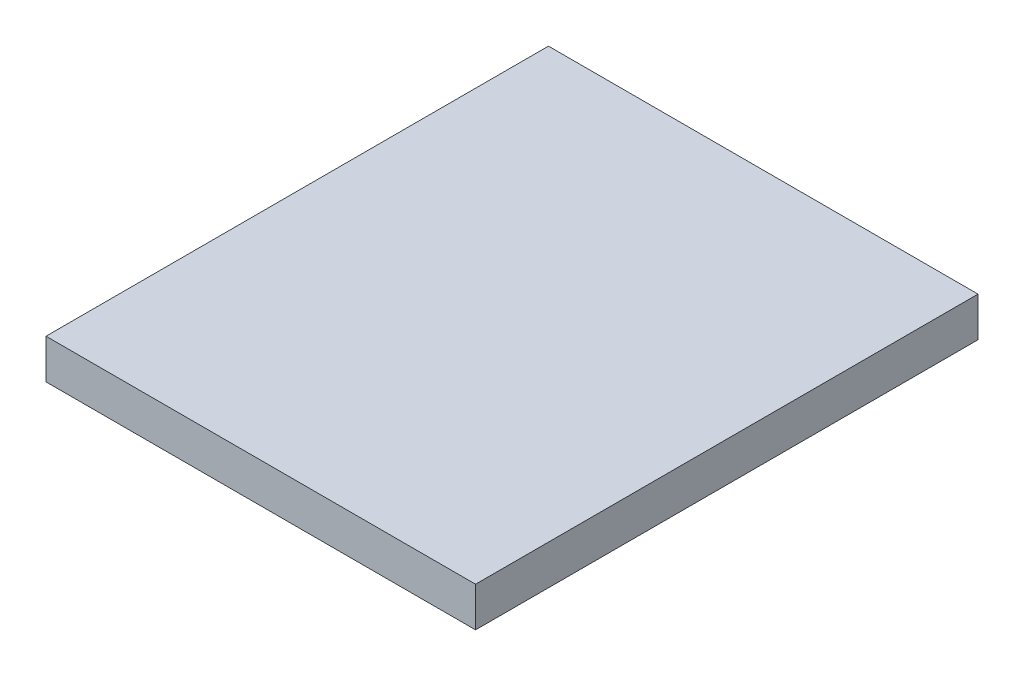
ISO-10303-21;
HEADER;
FILE_DESCRIPTION(('STEP AP214'),'2;1');
FILE_NAME('part.step','',(''),(''),'','','');
FILE_SCHEMA(('AUTOMOTIVE_DESIGN { 1 0 10303 214 1 1 1 1 }'));
ENDSEC;
DATA;
#1=APPLICATION_CONTEXT('core data for automotive mechanical design processes');
#2=APPLICATION_PROTOCOL_DEFINITION('international standard','automotive_design',2000,#1);
#3=PRODUCT_CONTEXT('',#1,'mechanical');
#4=PRODUCT('Part','Part','',(#3));
#5=PRODUCT_RELATED_PRODUCT_CATEGORY('part','',(#4));
#6=PRODUCT_DEFINITION_FORMATION('','',#4);
#7=PRODUCT_DEFINITION_CONTEXT('part definition',#1,'design');
#8=PRODUCT_DEFINITION('design','',#6,#7);
#9=PRODUCT_DEFINITION_SHAPE('','',#8);
#10=(LENGTH_UNIT() NAMED_UNIT(*) SI_UNIT(.MILLI.,.METRE.));
#11=(NAMED_UNIT(*) PLANE_ANGLE_UNIT() SI_UNIT($,.RADIAN.));
#12=(NAMED_UNIT(*) SI_UNIT($,.STERADIAN.) SOLID_ANGLE_UNIT());
#13=UNCERTAINTY_MEASURE_WITH_UNIT(LENGTH_MEASURE(1.E-05),#10,'distance_accuracy_value','');
#14=(GEOMETRIC_REPRESENTATION_CONTEXT(3) GLOBAL_UNCERTAINTY_ASSIGNED_CONTEXT((#13)) GLOBAL_UNIT_ASSIGNED_CONTEXT((#10,
#11,#12)) REPRESENTATION_CONTEXT('',''));
#15=CARTESIAN_POINT('',(0.,0.,0.));
#16=DIRECTION('',(0.,0.,1.));
#17=DIRECTION('',(1.,0.,0.));
#18=AXIS2_PLACEMENT_3D('',#15,#16,#17);
#19=CARTESIAN_POINT('',(76.,14.,-88.9));
#20=DIRECTION('',(-1.,0.,0.));
#21=DIRECTION('',(0.,0.,1.));
#22=AXIS2_PLACEMENT_3D('',#19,#20,#21);
#23=PLANE('',#22);
#24=DIRECTION('',(0.,0.,-1.));
#25=VECTOR('',#24,1.);
#26=CARTESIAN_POINT('',(76.,0.,-88.9));
#27=LINE('',#26,#25);
#28=CARTESIAN_POINT('',(76.,0.,88.9));
#29=VERTEX_POINT('',#28);
#30=CARTESIAN_POINT('',(76.,0.,-88.9));
#31=VERTEX_POINT('',#30);
#32=EDGE_CURVE('E112',#29,#31,#27,.T.);
#33=ORIENTED_EDGE('',*,*,#32,.T.);
#34=DIRECTION('',(0.,-1.,0.));
#35=VECTOR('',#34,1.);
#36=CARTESIAN_POINT('',(76.,14.,-88.9));
#37=LINE('',#36,#35);
#38=CARTESIAN_POINT('',(76.,14.,-88.9));
#39=VERTEX_POINT('',#38);
#40=EDGE_CURVE('E11',#39,#31,#37,.T.);
#41=ORIENTED_EDGE('',*,*,#40,.F.);
#42=DIRECTION('',(0.,0.,-1.));
#43=VECTOR('',#42,1.);
#44=CARTESIAN_POINT('',(76.,14.,-88.9));
#45=LINE('',#44,#43);
#46=CARTESIAN_POINT('',(76.,14.,88.9));
#47=VERTEX_POINT('',#46);
#48=EDGE_CURVE('E96',#47,#39,#45,.T.);
#49=ORIENTED_EDGE('',*,*,#48,.F.);
#50=DIRECTION('',(0.,-1.,0.));
#51=VECTOR('',#50,1.);
#52=CARTESIAN_POINT('',(76.,14.,88.9));
#53=LINE('',#52,#51);
#54=EDGE_CURVE('E108',#47,#29,#53,.T.);
#55=ORIENTED_EDGE('',*,*,#54,.T.);
#56=EDGE_LOOP('',(#33,#41,#49,#55));
#57=FACE_BOUND('',#56,.T.);
#58=ADVANCED_FACE('F44',(#57),#23,.F.);
#59=CARTESIAN_POINT('',(-76.,14.,-88.9));
#60=DIRECTION('',(0.,0.,1.));
#61=DIRECTION('',(1.,0.,0.));
#62=AXIS2_PLACEMENT_3D('',#59,#60,#61);
#63=PLANE('',#62);
#64=DIRECTION('',(-1.,0.,0.));
#65=VECTOR('',#64,1.);
#66=CARTESIAN_POINT('',(-76.,0.,-88.9));
#67=LINE('',#66,#65);
#68=CARTESIAN_POINT('',(-76.,0.,-88.9));
#69=VERTEX_POINT('',#68);
#70=EDGE_CURVE('E101',#31,#69,#67,.T.);
#71=ORIENTED_EDGE('',*,*,#70,.T.);
#72=DIRECTION('',(0.,-1.,0.));
#73=VECTOR('',#72,1.);
#74=CARTESIAN_POINT('',(-76.,14.,-88.9));
#75=LINE('',#74,#73);
#76=CARTESIAN_POINT('',(-76.,14.,-88.9));
#77=VERTEX_POINT('',#76);
#78=EDGE_CURVE('E53',#77,#69,#75,.T.);
#79=ORIENTED_EDGE('',*,*,#78,.F.);
#80=DIRECTION('',(-1.,0.,0.));
#81=VECTOR('',#80,1.);
#82=CARTESIAN_POINT('',(-76.,14.,-88.9));
#83=LINE('',#82,#81);
#84=EDGE_CURVE('E91',#39,#77,#83,.T.);
#85=ORIENTED_EDGE('',*,*,#84,.F.);
#86=ORIENTED_EDGE('',*,*,#40,.T.);
#87=EDGE_LOOP('',(#71,#79,#85,#86));
#88=FACE_BOUND('',#87,.T.);
#89=ADVANCED_FACE('F100',(#88),#63,.F.);
#90=CARTESIAN_POINT('',(-76.,14.,-88.9));
#91=DIRECTION('',(1.,0.,0.));
#92=DIRECTION('',(0.,0.,-1.));
#93=AXIS2_PLACEMENT_3D('',#90,#91,#92);
#94=PLANE('',#93);
#95=DIRECTION('',(0.,0.,1.));
#96=VECTOR('',#95,1.);
#97=CARTESIAN_POINT('',(-76.,0.,-88.9));
#98=LINE('',#97,#96);
#99=CARTESIAN_POINT('',(-76.,0.,88.9));
#100=VERTEX_POINT('',#99);
#101=EDGE_CURVE('E78',#69,#100,#98,.T.);
#102=ORIENTED_EDGE('',*,*,#101,.T.);
#103=DIRECTION('',(0.,-1.,0.));
#104=VECTOR('',#103,1.);
#105=CARTESIAN_POINT('',(-76.,14.,88.9));
#106=LINE('',#105,#104);
#107=CARTESIAN_POINT('',(-76.,14.,88.9));
#108=VERTEX_POINT('',#107);
#109=EDGE_CURVE('E103',#108,#100,#106,.T.);
#110=ORIENTED_EDGE('',*,*,#109,.F.);
#111=DIRECTION('',(0.,0.,1.));
#112=VECTOR('',#111,1.);
#113=CARTESIAN_POINT('',(-76.,14.,-88.9));
#114=LINE('',#113,#112);
#115=EDGE_CURVE('E94',#77,#108,#114,.T.);
#116=ORIENTED_EDGE('',*,*,#115,.F.);
#117=ORIENTED_EDGE('',*,*,#78,.T.);
#118=EDGE_LOOP('',(#102,#110,#116,#117));
#119=FACE_BOUND('',#118,.T.);
#120=ADVANCED_FACE('F104',(#119),#94,.F.);
#121=CARTESIAN_POINT('',(-76.,14.,88.9));
#122=DIRECTION('',(0.,0.,-1.));
#123=DIRECTION('',(-1.,0.,0.));
#124=AXIS2_PLACEMENT_3D('',#121,#122,#123);
#125=PLANE('',#124);
#126=DIRECTION('',(1.,0.,0.));
#127=VECTOR('',#126,1.);
#128=CARTESIAN_POINT('',(-76.,0.,88.9));
#129=LINE('',#128,#127);
#130=EDGE_CURVE('E84',#100,#29,#129,.T.);
#131=ORIENTED_EDGE('',*,*,#130,.T.);
#132=ORIENTED_EDGE('',*,*,#54,.F.);
#133=DIRECTION('',(1.,0.,0.));
#134=VECTOR('',#133,1.);
#135=CARTESIAN_POINT('',(-76.,14.,88.9));
#136=LINE('',#135,#134);
#137=EDGE_CURVE('E61',#108,#47,#136,.T.);
#138=ORIENTED_EDGE('',*,*,#137,.F.);
#139=ORIENTED_EDGE('',*,*,#109,.T.);
#140=EDGE_LOOP('',(#131,#132,#138,#139));
#141=FACE_BOUND('',#140,.T.);
#142=ADVANCED_FACE('F125',(#141),#125,.F.);
#143=CARTESIAN_POINT('',(0.,14.,0.));
#144=DIRECTION('',(0.,1.,0.));
#145=DIRECTION('',(0.,0.,1.));
#146=AXIS2_PLACEMENT_3D('',#143,#144,#145);
#147=PLANE('',#146);
#148=ORIENTED_EDGE('',*,*,#48,.T.);
#149=ORIENTED_EDGE('',*,*,#84,.T.);
#150=ORIENTED_EDGE('',*,*,#115,.T.);
#151=ORIENTED_EDGE('',*,*,#137,.T.);
#152=EDGE_LOOP('',(#148,#149,#150,#151));
#153=FACE_BOUND('',#152,.T.);
#154=ADVANCED_FACE('F92',(#153),#147,.T.);
#155=CARTESIAN_POINT('',(0.,0.,0.));
#156=DIRECTION('',(0.,1.,0.));
#157=DIRECTION('',(0.,0.,1.));
#158=AXIS2_PLACEMENT_3D('',#155,#156,#157);
#159=PLANE('',#158);
#160=ORIENTED_EDGE('',*,*,#32,.F.);
#161=ORIENTED_EDGE('',*,*,#130,.F.);
#162=ORIENTED_EDGE('',*,*,#101,.F.);
#163=ORIENTED_EDGE('',*,*,#70,.F.);
#164=EDGE_LOOP('',(#160,#161,#162,#163));
#165=FACE_BOUND('',#164,.T.);
#166=ADVANCED_FACE('F128',(#165),#159,.F.);
#167=CLOSED_SHELL('',(#58,#89,#120,#142,#154,#166));
#168=MANIFOLD_SOLID_BREP('B2',#167);
#169=ADVANCED_BREP_SHAPE_REPRESENTATION('',(#18,#168),#14);
#170=SHAPE_DEFINITION_REPRESENTATION(#9,#169);
ENDSEC;
END-ISO-10303-21;
